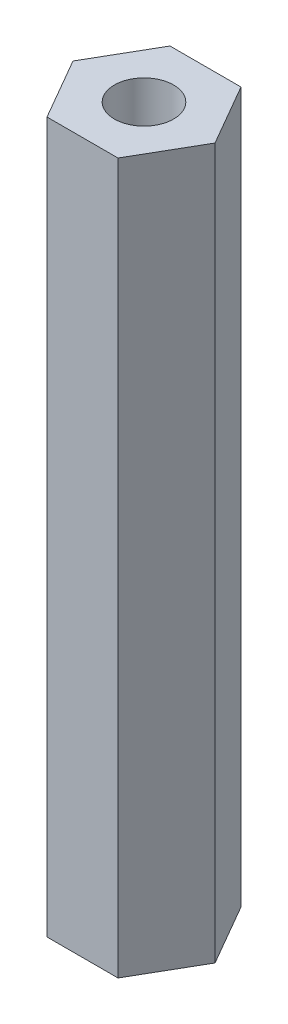
ISO-10303-21;
HEADER;
FILE_DESCRIPTION(('STEP AP214'),'2;1');
FILE_NAME('part.step','',(''),(''),'','','');
FILE_SCHEMA(('AUTOMOTIVE_DESIGN { 1 0 10303 214 1 1 1 1 }'));
ENDSEC;
DATA;
#1=APPLICATION_CONTEXT('core data for automotive mechanical design processes');
#2=APPLICATION_PROTOCOL_DEFINITION('international standard','automotive_design',2000,#1);
#3=PRODUCT_CONTEXT('',#1,'mechanical');
#4=PRODUCT('Part','Part','',(#3));
#5=PRODUCT_RELATED_PRODUCT_CATEGORY('part','',(#4));
#6=PRODUCT_DEFINITION_FORMATION('','',#4);
#7=PRODUCT_DEFINITION_CONTEXT('part definition',#1,'design');
#8=PRODUCT_DEFINITION('design','',#6,#7);
#9=PRODUCT_DEFINITION_SHAPE('','',#8);
#10=(LENGTH_UNIT() NAMED_UNIT(*) SI_UNIT(.MILLI.,.METRE.));
#11=(NAMED_UNIT(*) PLANE_ANGLE_UNIT() SI_UNIT($,.RADIAN.));
#12=(NAMED_UNIT(*) SI_UNIT($,.STERADIAN.) SOLID_ANGLE_UNIT());
#13=UNCERTAINTY_MEASURE_WITH_UNIT(LENGTH_MEASURE(1.E-05),#10,'distance_accuracy_value','');
#14=(GEOMETRIC_REPRESENTATION_CONTEXT(3) GLOBAL_UNCERTAINTY_ASSIGNED_CONTEXT((#13)) GLOBAL_UNIT_ASSIGNED_CONTEXT((#10,
#11,#12)) REPRESENTATION_CONTEXT('',''));
#15=CARTESIAN_POINT('',(0.,0.,0.));
#16=DIRECTION('',(0.,0.,1.));
#17=DIRECTION('',(1.,0.,0.));
#18=AXIS2_PLACEMENT_3D('',#15,#16,#17);
#19=CARTESIAN_POINT('',(3.,30.,0.));
#20=DIRECTION('',(-0.866025403784439,0.,0.5));
#21=DIRECTION('',(0.5,0.,0.866025403784439));
#22=AXIS2_PLACEMENT_3D('',#19,#20,#21);
#23=PLANE('',#22);
#24=DIRECTION('',(-0.5,0.,-0.866025403784439));
#25=VECTOR('',#24,1.);
#26=CARTESIAN_POINT('',(3.,0.,0.));
#27=LINE('',#26,#25);
#28=CARTESIAN_POINT('',(3.,0.,0.));
#29=VERTEX_POINT('',#28);
#30=CARTESIAN_POINT('',(1.5,0.,-2.59807621135332));
#31=VERTEX_POINT('',#30);
#32=EDGE_CURVE('E120',#29,#31,#27,.T.);
#33=ORIENTED_EDGE('',*,*,#32,.T.);
#34=DIRECTION('',(0.,-1.,0.));
#35=VECTOR('',#34,1.);
#36=CARTESIAN_POINT('',(1.5,30.,-2.59807621135332));
#37=LINE('',#36,#35);
#38=CARTESIAN_POINT('',(1.5,30.,-2.59807621135332));
#39=VERTEX_POINT('',#38);
#40=EDGE_CURVE('E11',#39,#31,#37,.T.);
#41=ORIENTED_EDGE('',*,*,#40,.F.);
#42=DIRECTION('',(-0.5,0.,-0.866025403784439));
#43=VECTOR('',#42,1.);
#44=CARTESIAN_POINT('',(3.,30.,0.));
#45=LINE('',#44,#43);
#46=CARTESIAN_POINT('',(3.,30.,0.));
#47=VERTEX_POINT('',#46);
#48=EDGE_CURVE('E131',#47,#39,#45,.T.);
#49=ORIENTED_EDGE('',*,*,#48,.F.);
#50=DIRECTION('',(0.,-1.,0.));
#51=VECTOR('',#50,1.);
#52=CARTESIAN_POINT('',(3.,30.,0.));
#53=LINE('',#52,#51);
#54=EDGE_CURVE('E116',#47,#29,#53,.T.);
#55=ORIENTED_EDGE('',*,*,#54,.T.);
#56=EDGE_LOOP('',(#33,#41,#49,#55));
#57=FACE_BOUND('',#56,.T.);
#58=ADVANCED_FACE('F36',(#57),#23,.F.);
#59=CARTESIAN_POINT('',(1.5,30.,-2.59807621135332));
#60=DIRECTION('',(0.,0.,1.));
#61=DIRECTION('',(1.,0.,0.));
#62=AXIS2_PLACEMENT_3D('',#59,#60,#61);
#63=PLANE('',#62);
#64=DIRECTION('',(-1.,0.,0.));
#65=VECTOR('',#64,1.);
#66=CARTESIAN_POINT('',(1.5,0.,-2.59807621135332));
#67=LINE('',#66,#65);
#68=CARTESIAN_POINT('',(-1.5,0.,-2.59807621135332));
#69=VERTEX_POINT('',#68);
#70=EDGE_CURVE('E123',#31,#69,#67,.T.);
#71=ORIENTED_EDGE('',*,*,#70,.T.);
#72=DIRECTION('',(0.,-1.,0.));
#73=VECTOR('',#72,1.);
#74=CARTESIAN_POINT('',(-1.5,30.,-2.59807621135332));
#75=LINE('',#74,#73);
#76=CARTESIAN_POINT('',(-1.5,30.,-2.59807621135332));
#77=VERTEX_POINT('',#76);
#78=EDGE_CURVE('E44',#77,#69,#75,.T.);
#79=ORIENTED_EDGE('',*,*,#78,.F.);
#80=DIRECTION('',(-1.,0.,0.));
#81=VECTOR('',#80,1.);
#82=CARTESIAN_POINT('',(1.5,30.,-2.59807621135332));
#83=LINE('',#82,#81);
#84=EDGE_CURVE('E89',#39,#77,#83,.T.);
#85=ORIENTED_EDGE('',*,*,#84,.F.);
#86=ORIENTED_EDGE('',*,*,#40,.T.);
#87=EDGE_LOOP('',(#71,#79,#85,#86));
#88=FACE_BOUND('',#87,.T.);
#89=ADVANCED_FACE('F156',(#88),#63,.F.);
#90=CARTESIAN_POINT('',(-1.5,30.,-2.59807621135332));
#91=DIRECTION('',(0.866025403784439,0.,0.5));
#92=DIRECTION('',(0.5,0.,-0.866025403784439));
#93=AXIS2_PLACEMENT_3D('',#90,#91,#92);
#94=PLANE('',#93);
#95=DIRECTION('',(-0.5,0.,0.866025403784439));
#96=VECTOR('',#95,1.);
#97=CARTESIAN_POINT('',(-1.5,0.,-2.59807621135332));
#98=LINE('',#97,#96);
#99=CARTESIAN_POINT('',(-3.,0.,0.));
#100=VERTEX_POINT('',#99);
#101=EDGE_CURVE('E126',#69,#100,#98,.T.);
#102=ORIENTED_EDGE('',*,*,#101,.T.);
#103=DIRECTION('',(0.,-1.,0.));
#104=VECTOR('',#103,1.);
#105=CARTESIAN_POINT('',(-3.,30.,0.));
#106=LINE('',#105,#104);
#107=CARTESIAN_POINT('',(-3.,30.,0.));
#108=VERTEX_POINT('',#107);
#109=EDGE_CURVE('E111',#108,#100,#106,.T.);
#110=ORIENTED_EDGE('',*,*,#109,.F.);
#111=DIRECTION('',(-0.5,0.,0.866025403784439));
#112=VECTOR('',#111,1.);
#113=CARTESIAN_POINT('',(-1.5,30.,-2.59807621135332));
#114=LINE('',#113,#112);
#115=EDGE_CURVE('E102',#77,#108,#114,.T.);
#116=ORIENTED_EDGE('',*,*,#115,.F.);
#117=ORIENTED_EDGE('',*,*,#78,.T.);
#118=EDGE_LOOP('',(#102,#110,#116,#117));
#119=FACE_BOUND('',#118,.T.);
#120=ADVANCED_FACE('F137',(#119),#94,.F.);
#121=CARTESIAN_POINT('',(-3.,30.,0.));
#122=DIRECTION('',(0.866025403784439,0.,-0.5));
#123=DIRECTION('',(-0.5,0.,-0.866025403784439));
#124=AXIS2_PLACEMENT_3D('',#121,#122,#123);
#125=PLANE('',#124);
#126=DIRECTION('',(0.5,0.,0.866025403784439));
#127=VECTOR('',#126,1.);
#128=CARTESIAN_POINT('',(-3.,0.,0.));
#129=LINE('',#128,#127);
#130=CARTESIAN_POINT('',(-1.5,0.,2.59807621135332));
#131=VERTEX_POINT('',#130);
#132=EDGE_CURVE('E110',#100,#131,#129,.T.);
#133=ORIENTED_EDGE('',*,*,#132,.T.);
#134=DIRECTION('',(0.,-1.,0.));
#135=VECTOR('',#134,1.);
#136=CARTESIAN_POINT('',(-1.5,30.,2.59807621135332));
#137=LINE('',#136,#135);
#138=CARTESIAN_POINT('',(-1.5,30.,2.59807621135332));
#139=VERTEX_POINT('',#138);
#140=EDGE_CURVE('E107',#139,#131,#137,.T.);
#141=ORIENTED_EDGE('',*,*,#140,.F.);
#142=DIRECTION('',(0.5,0.,0.866025403784439));
#143=VECTOR('',#142,1.);
#144=CARTESIAN_POINT('',(-3.,30.,0.));
#145=LINE('',#144,#143);
#146=EDGE_CURVE('E96',#108,#139,#145,.T.);
#147=ORIENTED_EDGE('',*,*,#146,.F.);
#148=ORIENTED_EDGE('',*,*,#109,.T.);
#149=EDGE_LOOP('',(#133,#141,#147,#148));
#150=FACE_BOUND('',#149,.T.);
#151=ADVANCED_FACE('F108',(#150),#125,.F.);
#152=CARTESIAN_POINT('',(-1.5,30.,2.59807621135332));
#153=DIRECTION('',(0.,0.,-1.));
#154=DIRECTION('',(-1.,0.,0.));
#155=AXIS2_PLACEMENT_3D('',#152,#153,#154);
#156=PLANE('',#155);
#157=DIRECTION('',(1.,0.,0.));
#158=VECTOR('',#157,1.);
#159=CARTESIAN_POINT('',(-1.5,0.,2.59807621135332));
#160=LINE('',#159,#158);
#161=CARTESIAN_POINT('',(1.5,0.,2.59807621135332));
#162=VERTEX_POINT('',#161);
#163=EDGE_CURVE('E75',#131,#162,#160,.T.);
#164=ORIENTED_EDGE('',*,*,#163,.T.);
#165=DIRECTION('',(0.,-1.,0.));
#166=VECTOR('',#165,1.);
#167=CARTESIAN_POINT('',(1.5,30.,2.59807621135332));
#168=LINE('',#167,#166);
#169=CARTESIAN_POINT('',(1.5,30.,2.59807621135332));
#170=VERTEX_POINT('',#169);
#171=EDGE_CURVE('E112',#170,#162,#168,.T.);
#172=ORIENTED_EDGE('',*,*,#171,.F.);
#173=DIRECTION('',(1.,0.,0.));
#174=VECTOR('',#173,1.);
#175=CARTESIAN_POINT('',(-1.5,30.,2.59807621135332));
#176=LINE('',#175,#174);
#177=EDGE_CURVE('E100',#139,#170,#176,.T.);
#178=ORIENTED_EDGE('',*,*,#177,.F.);
#179=ORIENTED_EDGE('',*,*,#140,.T.);
#180=EDGE_LOOP('',(#164,#172,#178,#179));
#181=FACE_BOUND('',#180,.T.);
#182=ADVANCED_FACE('F114',(#181),#156,.F.);
#183=CARTESIAN_POINT('',(1.5,30.,2.59807621135332));
#184=DIRECTION('',(-0.866025403784439,0.,-0.5));
#185=DIRECTION('',(-0.5,0.,0.866025403784439));
#186=AXIS2_PLACEMENT_3D('',#183,#184,#185);
#187=PLANE('',#186);
#188=DIRECTION('',(0.5,0.,-0.866025403784439));
#189=VECTOR('',#188,1.);
#190=CARTESIAN_POINT('',(1.5,0.,2.59807621135332));
#191=LINE('',#190,#189);
#192=EDGE_CURVE('E81',#162,#29,#191,.T.);
#193=ORIENTED_EDGE('',*,*,#192,.T.);
#194=ORIENTED_EDGE('',*,*,#54,.F.);
#195=DIRECTION('',(0.5,0.,-0.866025403784439));
#196=VECTOR('',#195,1.);
#197=CARTESIAN_POINT('',(1.5,30.,2.59807621135332));
#198=LINE('',#197,#196);
#199=EDGE_CURVE('E52',#170,#47,#198,.T.);
#200=ORIENTED_EDGE('',*,*,#199,.F.);
#201=ORIENTED_EDGE('',*,*,#171,.T.);
#202=EDGE_LOOP('',(#193,#194,#200,#201));
#203=FACE_BOUND('',#202,.T.);
#204=ADVANCED_FACE('F144',(#203),#187,.F.);
#205=CARTESIAN_POINT('',(0.,30.,0.));
#206=DIRECTION('',(0.,1.,0.));
#207=DIRECTION('',(0.,0.,1.));
#208=AXIS2_PLACEMENT_3D('',#205,#206,#207);
#209=PLANE('',#208);
#210=CARTESIAN_POINT('',(0.,30.,0.));
#211=DIRECTION('',(0.,1.,0.));
#212=DIRECTION('',(0.,0.,1.));
#213=AXIS2_PLACEMENT_3D('',#210,#211,#212);
#214=CIRCLE('',#213,1.25);
#215=CARTESIAN_POINT('',(0.,30.,1.25));
#216=VERTEX_POINT('',#215);
#217=EDGE_CURVE('E213',#216,#216,#214,.T.);
#218=ORIENTED_EDGE('',*,*,#217,.F.);
#219=EDGE_LOOP('',(#218));
#220=FACE_BOUND('',#219,.T.);
#221=ORIENTED_EDGE('',*,*,#48,.T.);
#222=ORIENTED_EDGE('',*,*,#84,.T.);
#223=ORIENTED_EDGE('',*,*,#115,.T.);
#224=ORIENTED_EDGE('',*,*,#146,.T.);
#225=ORIENTED_EDGE('',*,*,#177,.T.);
#226=ORIENTED_EDGE('',*,*,#199,.T.);
#227=EDGE_LOOP('',(#221,#222,#223,#224,#225,#226));
#228=FACE_BOUND('',#227,.T.);
#229=ADVANCED_FACE('F98',(#220,#228),#209,.T.);
#230=CARTESIAN_POINT('',(0.,0.,0.));
#231=DIRECTION('',(0.,1.,0.));
#232=DIRECTION('',(0.,0.,1.));
#233=AXIS2_PLACEMENT_3D('',#230,#231,#232);
#234=PLANE('',#233);
#235=CARTESIAN_POINT('',(0.,0.,0.));
#236=DIRECTION('',(0.,1.,0.));
#237=DIRECTION('',(0.,0.,1.));
#238=AXIS2_PLACEMENT_3D('',#235,#236,#237);
#239=CIRCLE('',#238,1.24999999999999);
#240=CARTESIAN_POINT('',(0.,0.,1.24999999999999));
#241=VERTEX_POINT('',#240);
#242=EDGE_CURVE('E124',#241,#241,#239,.T.);
#243=ORIENTED_EDGE('',*,*,#242,.T.);
#244=EDGE_LOOP('',(#243));
#245=FACE_BOUND('',#244,.T.);
#246=ORIENTED_EDGE('',*,*,#32,.F.);
#247=ORIENTED_EDGE('',*,*,#192,.F.);
#248=ORIENTED_EDGE('',*,*,#163,.F.);
#249=ORIENTED_EDGE('',*,*,#132,.F.);
#250=ORIENTED_EDGE('',*,*,#101,.F.);
#251=ORIENTED_EDGE('',*,*,#70,.F.);
#252=EDGE_LOOP('',(#246,#247,#248,#249,#250,#251));
#253=FACE_BOUND('',#252,.T.);
#254=ADVANCED_FACE('F140',(#245,#253),#234,.F.);
#255=CARTESIAN_POINT('',(0.,30.,0.));
#256=DIRECTION('',(0.,1.,0.));
#257=DIRECTION('',(0.,0.,1.));
#258=AXIS2_PLACEMENT_3D('',#255,#256,#257);
#259=CYLINDRICAL_SURFACE('',#258,1.24999999999999);
#260=ORIENTED_EDGE('',*,*,#242,.F.);
#261=EDGE_LOOP('',(#260));
#262=FACE_BOUND('',#261,.T.);
#263=ORIENTED_EDGE('',*,*,#217,.T.);
#264=EDGE_LOOP('',(#263));
#265=FACE_BOUND('',#264,.T.);
#266=ADVANCED_FACE('F193',(#262,#265),#259,.F.);
#267=CLOSED_SHELL('',(#58,#89,#120,#151,#182,#204,#229,#254,#266));
#268=MANIFOLD_SOLID_BREP('B2',#267);
#269=ADVANCED_BREP_SHAPE_REPRESENTATION('',(#18,#268),#14);
#270=SHAPE_DEFINITION_REPRESENTATION(#9,#269);
ENDSEC;
END-ISO-10303-21;
